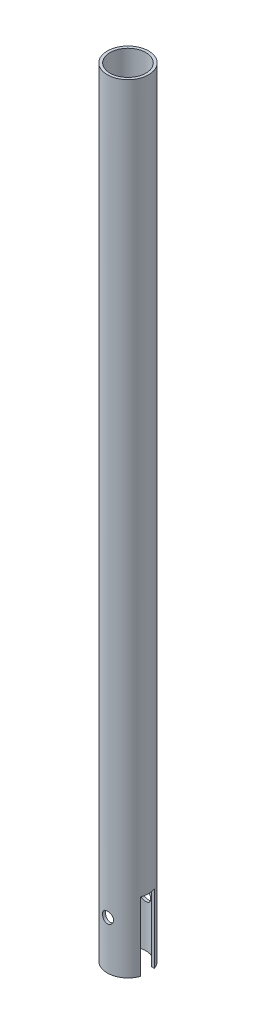
ISO-10303-21;
HEADER;
FILE_DESCRIPTION(('STEP AP214'),'2;1');
FILE_NAME('part.step','',(''),(''),'','','');
FILE_SCHEMA(('AUTOMOTIVE_DESIGN { 1 0 10303 214 1 1 1 1 }'));
ENDSEC;
DATA;
#1=APPLICATION_CONTEXT('core data for automotive mechanical design processes');
#2=APPLICATION_PROTOCOL_DEFINITION('international standard','automotive_design',2000,#1);
#3=PRODUCT_CONTEXT('',#1,'mechanical');
#4=PRODUCT('Part','Part','',(#3));
#5=PRODUCT_RELATED_PRODUCT_CATEGORY('part','',(#4));
#6=PRODUCT_DEFINITION_FORMATION('','',#4);
#7=PRODUCT_DEFINITION_CONTEXT('part definition',#1,'design');
#8=PRODUCT_DEFINITION('design','',#6,#7);
#9=PRODUCT_DEFINITION_SHAPE('','',#8);
#10=(LENGTH_UNIT() NAMED_UNIT(*) SI_UNIT(.MILLI.,.METRE.));
#11=(NAMED_UNIT(*) PLANE_ANGLE_UNIT() SI_UNIT($,.RADIAN.));
#12=(NAMED_UNIT(*) SI_UNIT($,.STERADIAN.) SOLID_ANGLE_UNIT());
#13=UNCERTAINTY_MEASURE_WITH_UNIT(LENGTH_MEASURE(1.E-05),#10,'distance_accuracy_value','');
#14=(GEOMETRIC_REPRESENTATION_CONTEXT(3) GLOBAL_UNCERTAINTY_ASSIGNED_CONTEXT((#13)) GLOBAL_UNIT_ASSIGNED_CONTEXT((#10,
#11,#12)) REPRESENTATION_CONTEXT('',''));
#15=CARTESIAN_POINT('',(0.,0.,0.));
#16=DIRECTION('',(0.,0.,1.));
#17=DIRECTION('',(1.,0.,0.));
#18=AXIS2_PLACEMENT_3D('',#15,#16,#17);
#19=CARTESIAN_POINT('',(0.,-282.5,0.));
#20=DIRECTION('',(0.,1.,0.));
#21=DIRECTION('',(0.,0.,1.));
#22=AXIS2_PLACEMENT_3D('',#19,#20,#21);
#23=PLANE('',#22);
#24=CARTESIAN_POINT('',(0.,-282.5,0.));
#25=DIRECTION('',(0.,1.,0.));
#26=DIRECTION('',(0.,0.,1.));
#27=AXIS2_PLACEMENT_3D('',#24,#25,#26);
#28=CIRCLE('',#27,15.);
#29=CARTESIAN_POINT('',(-14.142135623731,-282.5,4.99999999999993));
#30=VERTEX_POINT('',#29);
#31=CARTESIAN_POINT('',(14.142135623731,-282.5,4.99999999999993));
#32=VERTEX_POINT('',#31);
#33=EDGE_CURVE('E130',#30,#32,#28,.T.);
#34=ORIENTED_EDGE('',*,*,#33,.F.);
#35=DIRECTION('',(1.,0.,0.));
#36=VECTOR('',#35,1.);
#37=CARTESIAN_POINT('',(-282.5,-282.5,4.99999999999993));
#38=LINE('',#37,#36);
#39=CARTESIAN_POINT('',(-12.,-282.5,4.99999999999993));
#40=VERTEX_POINT('',#39);
#41=EDGE_CURVE('E110',#30,#40,#38,.T.);
#42=ORIENTED_EDGE('',*,*,#41,.T.);
#43=CARTESIAN_POINT('',(0.,-282.5,0.));
#44=DIRECTION('',(0.,1.,0.));
#45=DIRECTION('',(0.,0.,1.));
#46=AXIS2_PLACEMENT_3D('',#43,#44,#45);
#47=CIRCLE('',#46,13.);
#48=CARTESIAN_POINT('',(12.,-282.5,4.99999999999993));
#49=VERTEX_POINT('',#48);
#50=EDGE_CURVE('E134',#40,#49,#47,.T.);
#51=ORIENTED_EDGE('',*,*,#50,.T.);
#52=EDGE_CURVE('E124',#49,#32,#38,.T.);
#53=ORIENTED_EDGE('',*,*,#52,.T.);
#54=EDGE_LOOP('',(#34,#42,#51,#53));
#55=FACE_BOUND('',#54,.T.);
#56=ADVANCED_FACE('F38',(#55),#23,.F.);
#57=CARTESIAN_POINT('',(0.,282.5,0.));
#58=DIRECTION('',(0.,1.,0.));
#59=DIRECTION('',(0.,0.,1.));
#60=AXIS2_PLACEMENT_3D('',#57,#58,#59);
#61=PLANE('',#60);
#62=CARTESIAN_POINT('',(0.,282.5,0.));
#63=DIRECTION('',(0.,1.,0.));
#64=DIRECTION('',(0.,0.,1.));
#65=AXIS2_PLACEMENT_3D('',#62,#63,#64);
#66=CIRCLE('',#65,15.);
#67=CARTESIAN_POINT('',(0.,282.5,15.));
#68=VERTEX_POINT('',#67);
#69=EDGE_CURVE('E145',#68,#68,#66,.T.);
#70=ORIENTED_EDGE('',*,*,#69,.T.);
#71=EDGE_LOOP('',(#70));
#72=FACE_BOUND('',#71,.T.);
#73=CARTESIAN_POINT('',(0.,282.5,0.));
#74=DIRECTION('',(0.,1.,0.));
#75=DIRECTION('',(0.,0.,1.));
#76=AXIS2_PLACEMENT_3D('',#73,#74,#75);
#77=CIRCLE('',#76,13.);
#78=CARTESIAN_POINT('',(0.,282.5,13.));
#79=VERTEX_POINT('',#78);
#80=EDGE_CURVE('E140',#79,#79,#77,.T.);
#81=ORIENTED_EDGE('',*,*,#80,.F.);
#82=EDGE_LOOP('',(#81));
#83=FACE_BOUND('',#82,.T.);
#84=ADVANCED_FACE('F276',(#72,#83),#61,.T.);
#85=CARTESIAN_POINT('',(14.1421356237309,-282.5,-5.00000000000007));
#86=VERTEX_POINT('',#85);
#87=CARTESIAN_POINT('',(-14.1421356237309,-282.5,-5.00000000000007));
#88=VERTEX_POINT('',#87);
#89=EDGE_CURVE('E139',#86,#88,#28,.T.);
#90=ORIENTED_EDGE('',*,*,#89,.F.);
#91=DIRECTION('',(1.,0.,0.));
#92=VECTOR('',#91,1.);
#93=CARTESIAN_POINT('',(-282.5,-282.5,-5.00000000000007));
#94=LINE('',#93,#92);
#95=CARTESIAN_POINT('',(12.,-282.5,-5.00000000000007));
#96=VERTEX_POINT('',#95);
#97=EDGE_CURVE('E123',#96,#86,#94,.T.);
#98=ORIENTED_EDGE('',*,*,#97,.F.);
#99=CARTESIAN_POINT('',(-12.,-282.5,-5.00000000000007));
#100=VERTEX_POINT('',#99);
#101=EDGE_CURVE('E147',#96,#100,#47,.T.);
#102=ORIENTED_EDGE('',*,*,#101,.T.);
#103=EDGE_CURVE('E70',#88,#100,#94,.T.);
#104=ORIENTED_EDGE('',*,*,#103,.F.);
#105=EDGE_LOOP('',(#90,#98,#102,#104));
#106=FACE_BOUND('',#105,.T.);
#107=ADVANCED_FACE('F227',(#106),#23,.F.);
#108=CARTESIAN_POINT('',(0.,282.5,0.));
#109=DIRECTION('',(0.,-1.,0.));
#110=DIRECTION('',(0.,0.,-1.));
#111=AXIS2_PLACEMENT_3D('',#108,#109,#110);
#112=CYLINDRICAL_SURFACE('',#111,15.);
#113=CARTESIAN_POINT('',(0.,-243.5,-15.));
#114=CARTESIAN_POINT('',(-0.220509111665707,-243.50000523387,-14.9999966762032));
#115=CARTESIAN_POINT('',(-0.441074320443678,-243.518295228379,-14.995089723243));
#116=CARTESIAN_POINT('',(-0.875850902708924,-243.590842461477,-14.9759914724332));
#117=CARTESIAN_POINT('',(-1.09005916663817,-243.645117008852,-14.9617957066517));
#118=CARTESIAN_POINT('',(-1.50578317809062,-243.787743333728,-14.9256866650558));
#119=CARTESIAN_POINT('',(-1.70731490203056,-243.876051175332,-14.9037833426075));
#120=CARTESIAN_POINT('',(-2.0927073727853,-244.084074485333,-14.8545739830336));
#121=CARTESIAN_POINT('',(-2.27656694089924,-244.203792046719,-14.8272675859036));
#122=CARTESIAN_POINT('',(-2.62565900748002,-244.474167032827,-14.7694922980399));
#123=CARTESIAN_POINT('',(-2.79042337972557,-244.625417336017,-14.7389693535736));
#124=CARTESIAN_POINT('',(-3.09257427321276,-244.953296966127,-14.6785481935918));
#125=CARTESIAN_POINT('',(-3.22995726991329,-245.129929555235,-14.6486500589449));
#126=CARTESIAN_POINT('',(-3.4757281848683,-245.507296469651,-14.5923107492874));
#127=CARTESIAN_POINT('',(-3.58357755472975,-245.708392656523,-14.5659377712648));
#128=CARTESIAN_POINT('',(-3.76375096153988,-246.126680222185,-14.5204295463637));
#129=CARTESIAN_POINT('',(-3.83608154902738,-246.343868624663,-14.5012929650653));
#130=CARTESIAN_POINT('',(-3.94153840453008,-246.78299107565,-14.472982316048));
#131=CARTESIAN_POINT('',(-3.97551340489383,-247.004707079861,-14.4635929562298));
#132=CARTESIAN_POINT('',(-4.00594069411639,-247.450875366613,-14.4551966183274));
#133=CARTESIAN_POINT('',(-4.00239999411507,-247.675327130048,-14.4561877002889));
#134=CARTESIAN_POINT('',(-3.95857020005399,-248.113970830748,-14.4682475760406));
#135=CARTESIAN_POINT('',(-3.9193081212953,-248.328274364077,-14.4790347102306));
#136=CARTESIAN_POINT('',(-3.80679497444366,-248.747136668912,-14.5090202616138));
#137=CARTESIAN_POINT('',(-3.7335411898599,-248.951694660151,-14.5282193510522));
#138=CARTESIAN_POINT('',(-3.55428713930513,-249.347936287617,-14.5731132349677));
#139=CARTESIAN_POINT('',(-3.44792682275569,-249.539448678572,-14.5988788563741));
#140=CARTESIAN_POINT('',(-3.20573007647555,-249.902268317703,-14.6539645928489));
#141=CARTESIAN_POINT('',(-3.06988784448502,-250.073571578313,-14.6832854071037));
#142=CARTESIAN_POINT('',(-2.76733214526836,-250.39697799491,-14.7433502125973));
#143=CARTESIAN_POINT('',(-2.59975625456596,-250.54827263663,-14.7741094297766));
#144=CARTESIAN_POINT('',(-2.24123533641272,-250.820777560701,-14.8327276255263));
#145=CARTESIAN_POINT('',(-2.05028938841015,-250.941986657405,-14.8605864897711));
#146=CARTESIAN_POINT('',(-1.64919651099488,-251.151235805649,-14.9104364079659));
#147=CARTESIAN_POINT('',(-1.43896980510357,-251.239129540897,-14.9324014566712));
#148=CARTESIAN_POINT('',(-1.00600458878079,-251.378094377627,-14.96780088802));
#149=CARTESIAN_POINT('',(-0.783268823856654,-251.429173525448,-14.981237134675));
#150=CARTESIAN_POINT('',(-0.338508166291042,-251.491789753836,-14.9977831711677));
#151=CARTESIAN_POINT('',(-0.116648475282772,-251.504426079702,-15.0011799494192));
#152=CARTESIAN_POINT('',(0.326020091802384,-251.492833671506,-14.9980894338339));
#153=CARTESIAN_POINT('',(0.546829074124211,-251.468608747788,-14.9916031616071));
#154=CARTESIAN_POINT('',(0.977204899803543,-251.38488310508,-14.9696607099204));
#155=CARTESIAN_POINT('',(1.18689970405555,-251.325995507604,-14.9543605309265));
#156=CARTESIAN_POINT('',(1.59341394235211,-251.175328110984,-14.9165258978828));
#157=CARTESIAN_POINT('',(1.79023197843204,-251.083544747499,-14.8939906599234));
#158=CARTESIAN_POINT('',(2.16967694933589,-250.867652225639,-14.8435132111904));
#159=CARTESIAN_POINT('',(2.35195037692237,-250.742945066404,-14.8154737320985));
#160=CARTESIAN_POINT('',(2.69336927079431,-250.465496739684,-14.7572290473119));
#161=CARTESIAN_POINT('',(2.85251015759838,-250.312750034798,-14.7270234145527));
#162=CARTESIAN_POINT('',(3.14777848957546,-249.978428845011,-14.6667949173317));
#163=CARTESIAN_POINT('',(3.28313038499625,-249.796162877209,-14.6368012285772));
#164=CARTESIAN_POINT('',(3.5213438237024,-249.410870607801,-14.5813289436636));
#165=CARTESIAN_POINT('',(3.62420672244341,-249.207845172756,-14.5558501591602));
#166=CARTESIAN_POINT('',(3.79374823172204,-248.787809385847,-14.5125853674305));
#167=CARTESIAN_POINT('',(3.8606362450784,-248.570888376362,-14.4947549662348));
#168=CARTESIAN_POINT('',(3.95682410237656,-248.128321360653,-14.4687965026614));
#169=CARTESIAN_POINT('',(3.98613355205236,-247.902677599313,-14.4606659608681));
#170=CARTESIAN_POINT('',(4.00577979307212,-247.457010424211,-14.4552348910192));
#171=CARTESIAN_POINT('',(3.99736311235129,-247.237045359427,-14.4575879532022));
#172=CARTESIAN_POINT('',(3.94468751999858,-246.801792971929,-14.4720479199639));
#173=CARTESIAN_POINT('',(3.9004295306998,-246.58650552899,-14.4841545735456));
#174=CARTESIAN_POINT('',(3.77805031399794,-246.16828849576,-14.516551421902));
#175=CARTESIAN_POINT('',(3.70019322151267,-245.965276314541,-14.5367777005106));
#176=CARTESIAN_POINT('',(3.51303109124667,-245.575042338926,-14.5831363626058));
#177=CARTESIAN_POINT('',(3.40372112049205,-245.387823027398,-14.6092696723953));
#178=CARTESIAN_POINT('',(3.15297818537665,-245.028539281008,-14.6654584288421));
#179=CARTESIAN_POINT('',(3.01069459535829,-244.857082930048,-14.6956066620426));
#180=CARTESIAN_POINT('',(2.69966107022194,-244.540075096665,-14.7559100756513));
#181=CARTESIAN_POINT('',(2.53090470871748,-244.394529922662,-14.7860652559664));
#182=CARTESIAN_POINT('',(2.16735996217739,-244.130415524706,-14.8437562480818));
#183=CARTESIAN_POINT('',(1.97209192350356,-244.012489978701,-14.8712222262917));
#184=CARTESIAN_POINT('',(1.56377728083377,-243.811325168141,-14.9196762020573));
#185=CARTESIAN_POINT('',(1.35074218939259,-243.728063648673,-14.9406683536717));
#186=CARTESIAN_POINT('',(0.948749409761977,-243.609449429169,-14.9710950502695));
#187=CARTESIAN_POINT('',(0.761524033130066,-243.568501232815,-14.9818554118521));
#188=CARTESIAN_POINT('',(0.382879590634148,-243.513775587666,-14.9963089807291));
#189=CARTESIAN_POINT('',(0.191460940809718,-243.4999954556,-15.0000028859454));
#190=CARTESIAN_POINT('',(0.,-243.5,-15.));
#191=B_SPLINE_CURVE_WITH_KNOTS('',3,(#113,#114,#115,#116,#117,#118,#119,#120,#121,#122,#123,
#124,#125,#126,#127,#128,#129,#130,#131,#132,#133,#134,#135,#136,#137,#138,#139,#140,#141,#142,
#143,#144,#145,#146,#147,#148,#149,#150,#151,#152,#153,#154,#155,#156,#157,#158,#159,#160,#161,
#162,#163,#164,#165,#166,#167,#168,#169,#170,#171,#172,#173,#174,#175,#176,#177,#178,#179,#180,
#181,#182,#183,#184,#185,#186,#187,#188,#189,#190),.UNSPECIFIED.,.T.,.F.,(4,2,2,2,2,2,2,2,2,2,2,
2,2,2,2,2,2,2,2,2,2,2,2,2,2,2,2,2,2,2,2,2,2,2,2,2,2,2,4),(0.,0.660825197899139,1.3219684875229,
1.98226110594384,2.6425977341735,3.31669795909933,3.99088489850297,4.6766516504646,
5.362291882594,6.03244316500935,6.70246920808638,7.35382004091992,8.00522293625877,
8.66397346692996,9.3228537623526,10.0032251962465,10.683623438752,11.3669761920608,
12.0501795438028,12.7136543504909,13.377060578507,14.0290707128423,14.6811515155123,
15.346005720091,16.0109913651777,16.6947299276557,17.3784399604821,18.0581259539877,
18.7376381732797,19.394866848109,20.0520786104838,20.7042153090379,21.3564543425319,
22.0278867914996,22.6994824867208,23.3854450456898,24.0709665229755,24.6447963799386,
25.2185695593995),.UNSPECIFIED.);
#192=CARTESIAN_POINT('',(0.,-243.5,-15.));
#193=VERTEX_POINT('',#192);
#194=EDGE_CURVE('E191',#193,#193,#191,.T.);
#195=ORIENTED_EDGE('',*,*,#194,.T.);
#196=EDGE_LOOP('',(#195));
#197=FACE_BOUND('',#196,.T.);
#198=CARTESIAN_POINT('',(4.,-247.5,14.456832294801));
#199=CARTESIAN_POINT('',(3.99999468631742,-247.720351875481,14.456836113945));
#200=CARTESIAN_POINT('',(3.98172986449485,-247.940760000952,14.4619252909935));
#201=CARTESIAN_POINT('',(3.90929166520474,-248.375210843113,14.4816712231019));
#202=CARTESIAN_POINT('',(3.85510027241905,-248.589250309956,14.4963327781587));
#203=CARTESIAN_POINT('',(3.71271691120147,-249.004616139894,14.5334475035368));
#204=CARTESIAN_POINT('',(3.62457275084356,-249.205959917657,14.5558897136841));
#205=CARTESIAN_POINT('',(3.41693569127408,-249.59103348012,14.606023098408));
#206=CARTESIAN_POINT('',(3.29744035682899,-249.774761895014,14.6337146806885));
#207=CARTESIAN_POINT('',(3.02729695749118,-250.123985093975,14.6920027910693));
#208=CARTESIAN_POINT('',(2.87600595008415,-250.288974034929,14.7226508223289));
#209=CARTESIAN_POINT('',(2.5479485456804,-250.591563153902,14.7829540287301));
#210=CARTESIAN_POINT('',(2.37117951069327,-250.729160492284,14.8126091006688));
#211=CARTESIAN_POINT('',(1.99367634174653,-250.975169876806,14.8681597693684));
#212=CARTESIAN_POINT('',(1.79260363975894,-251.083079037266,14.8939875252459));
#213=CARTESIAN_POINT('',(1.37436608945817,-251.263369270734,14.9383825242367));
#214=CARTESIAN_POINT('',(1.1572039617502,-251.335756334563,14.9569509915253));
#215=CARTESIAN_POINT('',(0.718231923620181,-251.441310440472,14.9843710715292));
#216=CARTESIAN_POINT('',(0.496642448401833,-251.475337953252,14.9934355350053));
#217=CARTESIAN_POINT('',(0.0507271070171427,-251.505914240214,15.001570492355));
#218=CARTESIAN_POINT('',(-0.173598294877076,-251.50246928726,15.0006426589323));
#219=CARTESIAN_POINT('',(-0.612628474222695,-251.458804374921,14.9890535171952));
#220=CARTESIAN_POINT('',(-0.827433201442201,-251.419514084727,14.9786382805395));
#221=CARTESIAN_POINT('',(-1.24728263114213,-251.306775724436,14.9495349718099));
#222=CARTESIAN_POINT('',(-1.45232677636124,-251.233325706628,14.9308464280136));
#223=CARTESIAN_POINT('',(-1.84920789029504,-251.053640304815,14.886931381996));
#224=CARTESIAN_POINT('',(-2.0408933726588,-250.947086385799,14.8616417575466));
#225=CARTESIAN_POINT('',(-2.4039799975293,-250.704462360981,14.8072493701969));
#226=CARTESIAN_POINT('',(-2.57537717617274,-250.568386501942,14.7781458644853));
#227=CARTESIAN_POINT('',(-2.89857073893016,-250.265646284134,14.7182254587483));
#228=CARTESIAN_POINT('',(-3.04960384035148,-250.098171109909,14.6873833872759));
#229=CARTESIAN_POINT('',(-3.32162664209938,-249.739950647514,14.6282681005693));
#230=CARTESIAN_POINT('',(-3.44261451061105,-249.549203941569,14.5999950420307));
#231=CARTESIAN_POINT('',(-3.651693583714,-249.148199796381,14.549118045243));
#232=CARTESIAN_POINT('',(-3.7395773319603,-248.937829298272,14.5265501404503));
#233=CARTESIAN_POINT('',(-3.87848003366225,-248.504547001192,14.4900865003605));
#234=CARTESIAN_POINT('',(-3.92950812921311,-248.28163832713,14.4761886145698));
#235=CARTESIAN_POINT('',(-3.99193514186922,-247.836745577921,14.459096712616));
#236=CARTESIAN_POINT('',(-4.00447265242678,-247.614932902752,14.4555952643646));
#237=CARTESIAN_POINT('',(-3.99269962245616,-247.172380454389,14.4588515677209));
#238=CARTESIAN_POINT('',(-3.96839300344559,-246.951640569522,14.4656082275034));
#239=CARTESIAN_POINT('',(-3.88462543740026,-246.521886811815,14.4883224864021));
#240=CARTESIAN_POINT('',(-3.82584895825867,-246.312729124125,14.5041007939926));
#241=CARTESIAN_POINT('',(-3.67557973450926,-245.907240737281,14.542905379049));
#242=CARTESIAN_POINT('',(-3.58408271753295,-245.710911717145,14.5659326029695));
#243=CARTESIAN_POINT('',(-3.36865811017419,-245.331890085129,14.6172714494615));
#244=CARTESIAN_POINT('',(-3.2440619047585,-245.14959204822,14.6456880974578));
#245=CARTESIAN_POINT('',(-2.96680455975028,-244.808073396594,14.7043568386728));
#246=CARTESIAN_POINT('',(-2.81413814445932,-244.648857130092,14.7346092762046));
#247=CARTESIAN_POINT('',(-2.47980756500968,-244.3532950535,14.7945992976893));
#248=CARTESIAN_POINT('',(-2.29743283201769,-244.217743246043,14.824296730477));
#249=CARTESIAN_POINT('',(-1.91185687188147,-243.979178025179,14.8789334003425));
#250=CARTESIAN_POINT('',(-1.70865675403776,-243.876162879842,14.9038728906581));
#251=CARTESIAN_POINT('',(-1.28862826965174,-243.706540735277,14.9460230179852));
#252=CARTESIAN_POINT('',(-1.07191570576466,-243.639661961113,14.9632911696077));
#253=CARTESIAN_POINT('',(-0.629798769462634,-243.543422543871,14.9884060757449));
#254=CARTESIAN_POINT('',(-0.404396334640486,-243.514053586451,14.9962549180996));
#255=CARTESIAN_POINT('',(0.0412840026922955,-243.494188352517,15.0015482687538));
#256=CARTESIAN_POINT('',(0.261507023055727,-243.502527361738,14.9993045257616));
#257=CARTESIAN_POINT('',(0.697296609261436,-243.55513698715,14.9853698195772));
#258=CARTESIAN_POINT('',(0.91286334962563,-243.599406254234,14.9736792110957));
#259=CARTESIAN_POINT('',(1.33182024692843,-243.721961209837,14.9422262078185));
#260=CARTESIAN_POINT('',(1.53528402370309,-243.800010586945,14.9225199437846));
#261=CARTESIAN_POINT('',(1.92634419694272,-243.987699203492,14.8770963303299));
#262=CARTESIAN_POINT('',(2.11393836332431,-244.097342873226,14.8513781379851));
#263=CARTESIAN_POINT('',(2.47335653734735,-244.348516544274,14.7958266244824));
#264=CARTESIAN_POINT('',(2.64462672346663,-244.490818761397,14.7659018674327));
#265=CARTESIAN_POINT('',(2.96125074312267,-244.80180549873,14.7056800015451));
#266=CARTESIAN_POINT('',(3.10659774486097,-244.970496951639,14.6753827967944));
#267=CARTESIAN_POINT('',(3.37041400465123,-245.333936791635,14.6170791927771));
#268=CARTESIAN_POINT('',(3.48822188522467,-245.529176627314,14.5891378244929));
#269=CARTESIAN_POINT('',(3.68917378060109,-245.93741262172,14.5396278780694));
#270=CARTESIAN_POINT('',(3.77234046734664,-246.150397057079,14.5180551344989));
#271=CARTESIAN_POINT('',(3.89076248504962,-246.552162672102,14.4867200130775));
#272=CARTESIAN_POINT('',(3.93163036798979,-246.739202529113,14.4756028054439));
#273=CARTESIAN_POINT('',(3.98624988587759,-247.117481115988,14.4606577042314));
#274=CARTESIAN_POINT('',(4.0000046126432,-247.308719364578,14.4568289795203));
#275=CARTESIAN_POINT('',(4.,-247.5,14.456832294801));
#276=B_SPLINE_CURVE_WITH_KNOTS('',3,(#198,#199,#200,#201,#202,#203,#204,#205,#206,#207,#208,
#209,#210,#211,#212,#213,#214,#215,#216,#217,#218,#219,#220,#221,#222,#223,#224,#225,#226,#227,
#228,#229,#230,#231,#232,#233,#234,#235,#236,#237,#238,#239,#240,#241,#242,#243,#244,#245,#246,
#247,#248,#249,#250,#251,#252,#253,#254,#255,#256,#257,#258,#259,#260,#261,#262,#263,#264,#265,
#266,#267,#268,#269,#270,#271,#272,#273,#274,#275),.UNSPECIFIED.,.T.,.F.,(4,2,2,2,2,2,2,2,2,2,2,
2,2,2,2,2,2,2,2,2,2,2,2,2,2,2,2,2,2,2,2,2,2,2,2,2,2,2,4),(0.,0.66035225623206,1.32103589570041,
1.9807926231923,2.64060061312211,3.31531832260425,3.99010594248924,4.67570414741608,
5.36118668608491,6.03096608632961,6.70063336771207,7.35341141601607,8.00622668881391,
8.6655289781114,9.32495986788981,10.0046352460066,10.6843520527916,11.3682603019535,
12.0519988484194,12.7153066848897,13.3785439269193,14.0290370087007,14.6796150573457,
15.3444926994046,16.0094954308787,16.6937181392419,17.3779044202113,18.0568707918772,
18.7356866392293,19.3936810983785,20.0516508523085,20.7050902974225,21.3586214153685,
22.0295770798808,22.7007093076701,23.3866007797608,24.0720426420754,24.6453393534799,
25.2185706858622),.UNSPECIFIED.);
#277=CARTESIAN_POINT('',(4.,-247.5,14.456832294801));
#278=VERTEX_POINT('',#277);
#279=EDGE_CURVE('E185',#278,#278,#276,.T.);
#280=ORIENTED_EDGE('',*,*,#279,.T.);
#281=EDGE_LOOP('',(#280));
#282=FACE_BOUND('',#281,.T.);
#283=ORIENTED_EDGE('',*,*,#69,.F.);
#284=EDGE_LOOP('',(#283));
#285=FACE_BOUND('',#284,.T.);
#286=ORIENTED_EDGE('',*,*,#33,.T.);
#287=DIRECTION('',(0.,-1.,0.));
#288=VECTOR('',#287,1.);
#289=CARTESIAN_POINT('',(14.1421356237309,282.5,5.00000000000006));
#290=LINE('',#289,#288);
#291=CARTESIAN_POINT('',(14.142135623731,-232.5,4.99999999999994));
#292=VERTEX_POINT('',#291);
#293=EDGE_CURVE('E135',#32,#292,#290,.F.);
#294=ORIENTED_EDGE('',*,*,#293,.T.);
#295=CARTESIAN_POINT('',(0.,-232.5,0.));
#296=DIRECTION('',(0.,1.,0.));
#297=DIRECTION('',(0.,0.,1.));
#298=AXIS2_PLACEMENT_3D('',#295,#296,#297);
#299=CIRCLE('',#298,15.);
#300=CARTESIAN_POINT('',(14.1421356237309,-232.5,-5.00000000000007));
#301=VERTEX_POINT('',#300);
#302=EDGE_CURVE('E218',#292,#301,#299,.T.);
#303=ORIENTED_EDGE('',*,*,#302,.T.);
#304=DIRECTION('',(0.,-1.,0.));
#305=VECTOR('',#304,1.);
#306=CARTESIAN_POINT('',(14.1421356237309,282.5,-5.00000000000007));
#307=LINE('',#306,#305);
#308=EDGE_CURVE('E212',#301,#86,#307,.T.);
#309=ORIENTED_EDGE('',*,*,#308,.T.);
#310=ORIENTED_EDGE('',*,*,#89,.T.);
#311=DIRECTION('',(0.,-1.,0.));
#312=VECTOR('',#311,1.);
#313=CARTESIAN_POINT('',(-14.1421356237309,282.5,-5.00000000000007));
#314=LINE('',#313,#312);
#315=CARTESIAN_POINT('',(-14.1421356237309,-232.5,-5.00000000000007));
#316=VERTEX_POINT('',#315);
#317=EDGE_CURVE('E209',#88,#316,#314,.F.);
#318=ORIENTED_EDGE('',*,*,#317,.T.);
#319=CARTESIAN_POINT('',(-14.142135623731,-232.5,4.99999999999994));
#320=VERTEX_POINT('',#319);
#321=EDGE_CURVE('E132',#316,#320,#299,.T.);
#322=ORIENTED_EDGE('',*,*,#321,.T.);
#323=DIRECTION('',(0.,-1.,0.));
#324=VECTOR('',#323,1.);
#325=CARTESIAN_POINT('',(-14.1421356237309,282.5,5.00000000000006));
#326=LINE('',#325,#324);
#327=EDGE_CURVE('E114',#320,#30,#326,.T.);
#328=ORIENTED_EDGE('',*,*,#327,.T.);
#329=EDGE_LOOP('',(#286,#294,#303,#309,#310,#318,#322,#328));
#330=FACE_BOUND('',#329,.T.);
#331=ADVANCED_FACE('F40',(#197,#282,#285,#330),#112,.T.);
#332=CARTESIAN_POINT('',(0.,282.5,0.));
#333=DIRECTION('',(0.,-1.,0.));
#334=DIRECTION('',(0.,0.,-1.));
#335=AXIS2_PLACEMENT_3D('',#332,#333,#334);
#336=CYLINDRICAL_SURFACE('',#335,13.);
#337=CARTESIAN_POINT('',(0.,-243.5,-13.));
#338=CARTESIAN_POINT('',(-0.219172943108158,-243.500001921842,-12.9999985837487));
#339=CARTESIAN_POINT('',(-0.438365522698947,-243.518073295206,-12.9944047158586));
#340=CARTESIAN_POINT('',(-0.870351057968741,-243.58969882387,-12.9726371053014));
#341=CARTESIAN_POINT('',(-1.08314237260056,-243.643261998265,-12.9564606734307));
#342=CARTESIAN_POINT('',(-1.49603309396941,-243.783901413786,-12.9152971697535));
#343=CARTESIAN_POINT('',(-1.69615125418069,-243.870926721554,-12.8903234932247));
#344=CARTESIAN_POINT('',(-2.07895491073436,-244.075806414734,-12.8341507183588));
#345=CARTESIAN_POINT('',(-2.26163781838711,-244.193665368468,-12.8029506976878));
#346=CARTESIAN_POINT('',(-2.60987398495357,-244.46059535088,-12.7365950481322));
#347=CARTESIAN_POINT('',(-2.77482977131674,-244.610424838486,-12.7013552117493));
#348=CARTESIAN_POINT('',(-3.07771416539745,-244.935427247016,-12.6313850563073));
#349=CARTESIAN_POINT('',(-3.21563793325194,-245.110604696544,-12.5966548295175));
#350=CARTESIAN_POINT('',(-3.46374552369844,-245.486457208855,-12.5307375569115));
#351=CARTESIAN_POINT('',(-3.57318962723974,-245.687640578596,-12.4996547208754));
#352=CARTESIAN_POINT('',(-3.75644488363177,-246.106667927474,-12.4458149677457));
#353=CARTESIAN_POINT('',(-3.83026509829397,-246.324507653307,-12.4230559336455));
#354=CARTESIAN_POINT('',(-3.93800321026308,-246.763934612106,-12.3893201800033));
#355=CARTESIAN_POINT('',(-3.9730267911173,-246.985225067219,-12.3780178006712));
#356=CARTESIAN_POINT('',(-4.00563111791087,-247.43080748114,-12.3675074101));
#357=CARTESIAN_POINT('',(-4.00322147146571,-247.655098655016,-12.3682962955151));
#358=CARTESIAN_POINT('',(-3.96189396455672,-248.091230141224,-12.3815913869604));
#359=CARTESIAN_POINT('',(-3.92437369402148,-248.303218850725,-12.3936490135325));
#360=CARTESIAN_POINT('',(-3.81615290498389,-248.717733393271,-12.4273954440124));
#361=CARTESIAN_POINT('',(-3.74544895828905,-248.92025824623,-12.4490852430036));
#362=CARTESIAN_POINT('',(-3.57186443402679,-249.313460095665,-12.5000014147365));
#363=CARTESIAN_POINT('',(-3.46853941654592,-249.50392697125,-12.5293308435506));
#364=CARTESIAN_POINT('',(-3.23295451696217,-249.86528108875,-12.5921734714446));
#365=CARTESIAN_POINT('',(-3.10068731271404,-250.036163359214,-12.62568772833));
#366=CARTESIAN_POINT('',(-2.80408228262994,-250.361408776662,-12.6949310396933));
#367=CARTESIAN_POINT('',(-2.63858832591731,-250.514712565133,-12.7306926222691));
#368=CARTESIAN_POINT('',(-2.28379541764926,-250.791644408687,-12.7990966106587));
#369=CARTESIAN_POINT('',(-2.09449480981528,-250.915270397281,-12.8317387991713));
#370=CARTESIAN_POINT('',(-1.69546584739521,-251.130025954255,-12.8905511373571));
#371=CARTESIAN_POINT('',(-1.48559743793386,-251.220909728078,-12.9166718999808));
#372=CARTESIAN_POINT('',(-1.05256186981956,-251.365772507917,-12.959142046389));
#373=CARTESIAN_POINT('',(-0.829398642031533,-251.419762364021,-12.9754943028036));
#374=CARTESIAN_POINT('',(-0.385105664864488,-251.48751609315,-12.996125801437));
#375=CARTESIAN_POINT('',(-0.164214373456249,-251.502714705131,-13.0008354422861));
#376=CARTESIAN_POINT('',(0.276982356015461,-251.496490467024,-12.9989200063321));
#377=CARTESIAN_POINT('',(0.49728787237659,-251.475072786126,-12.9922965294463));
#378=CARTESIAN_POINT('',(0.925571602902952,-251.39737903578,-12.9687414969643));
#379=CARTESIAN_POINT('',(1.1337187175601,-251.341950705668,-12.9520607954816));
#380=CARTESIAN_POINT('',(1.53770562273872,-251.198837847146,-12.9103345307273));
#381=CARTESIAN_POINT('',(1.73354390450734,-251.111149373448,-12.8852879443756));
#382=CARTESIAN_POINT('',(2.11255922889336,-250.90365761038,-12.8286676582193));
#383=CARTESIAN_POINT('',(2.29532163039123,-250.78313664647,-12.7969522254664));
#384=CARTESIAN_POINT('',(2.63851213664824,-250.514266339838,-12.7306266724605));
#385=CARTESIAN_POINT('',(2.79893434148182,-250.365909670048,-12.6960157913837));
#386=CARTESIAN_POINT('',(3.09927056018191,-250.038833401102,-12.6261329181932));
#387=CARTESIAN_POINT('',(3.23816262016192,-249.859167848101,-12.5908864468145));
#388=CARTESIAN_POINT('',(3.48390975546085,-249.478313330796,-12.5251192663438));
#389=CARTESIAN_POINT('',(3.59076547791575,-249.277124801369,-12.4945984617991));
#390=CARTESIAN_POINT('',(3.76871415530626,-248.859443486142,-12.4420825365784));
#391=CARTESIAN_POINT('',(3.83995734204779,-248.643019460454,-12.4200516926804));
#392=CARTESIAN_POINT('',(3.94475052243649,-248.200434768548,-12.3871715179266));
#393=CARTESIAN_POINT('',(3.97831429744216,-247.974277693668,-12.376318099014));
#394=CARTESIAN_POINT('',(4.00582647580866,-247.529303855784,-12.3674386474697));
#395=CARTESIAN_POINT('',(4.00144721441457,-247.310599990898,-12.3688710878687));
#396=CARTESIAN_POINT('',(3.95721713123478,-246.877204322305,-12.383091699643));
#397=CARTESIAN_POINT('',(3.9173678708517,-246.662512342419,-12.3958793711567));
#398=CARTESIAN_POINT('',(3.80443315735091,-246.246125142925,-12.4309970121687));
#399=CARTESIAN_POINT('',(3.73181232996621,-246.04429178863,-12.4531933302876));
#400=CARTESIAN_POINT('',(3.55576002495547,-245.655512886749,-12.5045968200808));
#401=CARTESIAN_POINT('',(3.4523224201325,-245.468570309222,-12.5338053857525));
#402=CARTESIAN_POINT('',(3.21296345751965,-245.107174985039,-12.5973303286733));
#403=CARTESIAN_POINT('',(3.07595504034662,-244.933469011735,-12.6317988648256));
#404=CARTESIAN_POINT('',(2.77527343515751,-244.610971866041,-12.7012452733731));
#405=CARTESIAN_POINT('',(2.61159320000448,-244.462187299427,-12.7362232781481));
#406=CARTESIAN_POINT('',(2.25604634155052,-244.189101640806,-12.8040608482866));
#407=CARTESIAN_POINT('',(2.06345773137062,-244.06571284933,-12.8368198127607));
#408=CARTESIAN_POINT('',(1.6592623840196,-243.853231086695,-12.8952876611706));
#409=CARTESIAN_POINT('',(1.44766372806481,-243.764123626758,-12.9209995221938));
#410=CARTESIAN_POINT('',(1.03185930514284,-243.62979857588,-12.9605069669283));
#411=CARTESIAN_POINT('',(0.828806517031051,-243.581261057822,-12.975190696109));
#412=CARTESIAN_POINT('',(0.417174383657033,-243.516363881353,-12.9949369818214));
#413=CARTESIAN_POINT('',(0.208596085316668,-243.499998170902,-13.0000013479058));
#414=CARTESIAN_POINT('',(0.,-243.5,-13.));
#415=B_SPLINE_CURVE_WITH_KNOTS('',3,(#337,#338,#339,#340,#341,#342,#343,#344,#345,#346,#347,
#348,#349,#350,#351,#352,#353,#354,#355,#356,#357,#358,#359,#360,#361,#362,#363,#364,#365,#366,
#367,#368,#369,#370,#371,#372,#373,#374,#375,#376,#377,#378,#379,#380,#381,#382,#383,#384,#385,
#386,#387,#388,#389,#390,#391,#392,#393,#394,#395,#396,#397,#398,#399,#400,#401,#402,#403,#404,
#405,#406,#407,#408,#409,#410,#411,#412,#413,#414),.UNSPECIFIED.,.T.,.F.,(4,2,2,2,2,2,2,2,2,2,2,
2,2,2,2,2,2,2,2,2,2,2,2,2,2,2,2,2,2,2,2,2,2,2,2,2,2,2,4),(0.,0.656752296706404,1.31367154984093,
1.96959482663931,2.62561534027589,3.29939203924103,3.97328926246382,4.66325239950766,
5.35303993483892,6.02261825492435,6.69202472381783,7.33586971906418,7.97978124432903,
8.6328744918095,9.28613315816512,9.96817015993197,10.6502546387186,11.337357751299,
12.0242587074941,12.6853593330308,13.3463666374628,13.9915318440469,14.6367759780257,
15.2974465070423,15.9582911860325,16.6444697560881,17.3306344643609,18.0138796233906,
18.6968748019418,19.3499255144245,20.0029474807923,20.6469886056139,21.2911578685365,
21.9598589697368,22.6287370402031,23.3185550517439,24.0080811951411,24.6332575269447,
25.2583162416424),.UNSPECIFIED.);
#416=CARTESIAN_POINT('',(0.,-243.5,-13.));
#417=VERTEX_POINT('',#416);
#418=EDGE_CURVE('E43',#417,#417,#415,.T.);
#419=ORIENTED_EDGE('',*,*,#418,.F.);
#420=EDGE_LOOP('',(#419));
#421=FACE_BOUND('',#420,.T.);
#422=CARTESIAN_POINT('',(4.,-247.5,12.369316876853));
#423=CARTESIAN_POINT('',(3.99999801911511,-247.718895633332,12.3693186039437));
#424=CARTESIAN_POINT('',(3.98197071667171,-247.937810969677,12.3751910392593));
#425=CARTESIAN_POINT('',(3.91053610201703,-248.36922236337,12.3979463497334));
#426=CARTESIAN_POINT('',(3.85711835938025,-248.581716508926,12.4148324708708));
#427=CARTESIAN_POINT('',(3.71690370106221,-248.993975615948,12.4575254794133));
#428=CARTESIAN_POINT('',(3.63016446342584,-249.193761881516,12.4833169442959));
#429=CARTESIAN_POINT('',(3.42596036632786,-249.575999701798,12.5408933805394));
#430=CARTESIAN_POINT('',(3.30849039649876,-249.758448366468,12.5726793485105));
#431=CARTESIAN_POINT('',(3.04197085623715,-250.106907138944,12.6398503897334));
#432=CARTESIAN_POINT('',(2.89207511617123,-250.272254846984,12.6753151386567));
#433=CARTESIAN_POINT('',(2.56677072449477,-250.575907436167,12.7451687686073));
#434=CARTESIAN_POINT('',(2.3913586280337,-250.714208659964,12.7795575036037));
#435=CARTESIAN_POINT('',(2.01525938208343,-250.962747275999,12.8442933421818));
#436=CARTESIAN_POINT('',(1.81410355849338,-251.072305135706,12.8745356678172));
#437=CARTESIAN_POINT('',(1.39513299722327,-251.255777884019,12.9266426148966));
#438=CARTESIAN_POINT('',(1.17732206216617,-251.329700880637,12.9485091418561));
#439=CARTESIAN_POINT('',(0.738157579337927,-251.437601429225,12.9808368461316));
#440=CARTESIAN_POINT('',(0.517106217993636,-251.472710553444,12.9916204300486));
#441=CARTESIAN_POINT('',(0.0720049610420021,-251.505569212853,13.0017046369346));
#442=CARTESIAN_POINT('',(-0.15204426222767,-251.503326989111,13.0010077929045));
#443=CARTESIAN_POINT('',(-0.588827128442284,-251.462296890544,12.9884354757464));
#444=CARTESIAN_POINT('',(-0.801688466542009,-251.424735190597,12.9769350788328));
#445=CARTESIAN_POINT('',(-1.21792501207421,-251.316140819166,12.9445070377917));
#446=CARTESIAN_POINT('',(-1.42129960650809,-251.245105988054,12.9235787853994));
#447=CARTESIAN_POINT('',(-1.81565196791397,-251.070777513163,12.8741372192068));
#448=CARTESIAN_POINT('',(-2.00645142072049,-250.967106521837,12.8455357891992));
#449=CARTESIAN_POINT('',(-2.36833122304075,-250.730749615188,12.7837692511187));
#450=CARTESIAN_POINT('',(-2.53940668800685,-250.598056536159,12.7506030170365));
#451=CARTESIAN_POINT('',(-2.86429636287498,-250.301101778663,12.6816607270863));
#452=CARTESIAN_POINT('',(-3.01713209266503,-250.135780029851,12.6458333714272));
#453=CARTESIAN_POINT('',(-3.29319578318252,-249.781512121343,12.5767708183454));
#454=CARTESIAN_POINT('',(-3.41642047456242,-249.59256335649,12.5435359074272));
#455=CARTESIAN_POINT('',(-3.63085630567519,-249.19371386355,12.4831676811185));
#456=CARTESIAN_POINT('',(-3.72171608489966,-248.983613170595,12.4561024174922));
#457=CARTESIAN_POINT('',(-3.86646467810647,-248.550062565503,12.4119395774138));
#458=CARTESIAN_POINT('',(-3.92036629605917,-248.326617305718,12.3948385492109));
#459=CARTESIAN_POINT('',(-3.9878036768142,-247.882070943656,12.3733032661437));
#460=CARTESIAN_POINT('',(-4.00283354414281,-247.661219039525,12.3684004472341));
#461=CARTESIAN_POINT('',(-3.99628663681014,-247.220137228088,12.3705178057723));
#462=CARTESIAN_POINT('',(-3.97471530867987,-246.999907233121,12.3775362092534));
#463=CARTESIAN_POINT('',(-3.89691182757581,-246.572674790519,12.4022436604499));
#464=CARTESIAN_POINT('',(-3.84165844205441,-246.365474860406,12.4196310950035));
#465=CARTESIAN_POINT('',(-3.69920288634877,-245.963306235824,12.4628006686262));
#466=CARTESIAN_POINT('',(-3.61199561171696,-245.768339501369,12.4885841488415));
#467=CARTESIAN_POINT('',(-3.40532167264434,-245.390138176738,12.5465364709729));
#468=CARTESIAN_POINT('',(-3.28502089537804,-245.207384295721,12.5788637480404));
#469=CARTESIAN_POINT('',(-3.01655511441066,-244.864112908898,12.6459284171835));
#470=CARTESIAN_POINT('',(-2.86838309291512,-244.703601021194,12.6806664148693));
#471=CARTESIAN_POINT('',(-2.54132911795291,-244.402750842726,12.7503196549039));
#472=CARTESIAN_POINT('',(-2.36145596254204,-244.263476104598,12.7851864228121));
#473=CARTESIAN_POINT('',(-1.98005258597699,-244.017051927713,12.8497760997718));
#474=CARTESIAN_POINT('',(-1.77852339364156,-243.909900963761,12.8794992530072));
#475=CARTESIAN_POINT('',(-1.36080869978189,-243.731797794001,12.9302779102282));
#476=CARTESIAN_POINT('',(-1.14474466512892,-243.660579716795,12.9513968466186));
#477=CARTESIAN_POINT('',(-0.702944417606215,-243.555716468489,12.9828670740302));
#478=CARTESIAN_POINT('',(-0.477211151465622,-243.522059933797,12.9932216215646));
#479=CARTESIAN_POINT('',(-0.0322851569118239,-243.494175498766,13.0017874205747));
#480=CARTESIAN_POINT('',(0.18680318615842,-243.498409017632,13.0004725447557));
#481=CARTESIAN_POINT('',(0.621007843100269,-243.54248039501,12.9869752203231));
#482=CARTESIAN_POINT('',(0.836124401762878,-243.582316051746,12.9747934437614));
#483=CARTESIAN_POINT('',(1.25379230665728,-243.695491624487,12.9410753081768));
#484=CARTESIAN_POINT('',(1.45646200220844,-243.768430493353,12.919651071453));
#485=CARTESIAN_POINT('',(1.84678805760374,-243.945381267967,12.8696594866927));
#486=CARTESIAN_POINT('',(2.03444187508313,-244.049398421581,12.8410909324027));
#487=CARTESIAN_POINT('',(2.39618281580515,-244.289549472636,12.7786202811857));
#488=CARTESIAN_POINT('',(2.56961302229381,-244.426634667597,12.7445726445579));
#489=CARTESIAN_POINT('',(2.89152018312206,-244.727338979043,12.6754199625408));
#490=CARTESIAN_POINT('',(3.03998975450389,-244.890965918131,12.6403146079033));
#491=CARTESIAN_POINT('',(3.31252080641523,-245.246353952266,12.571699027057));
#492=CARTESIAN_POINT('',(3.43565508724777,-245.438844710169,12.5382751258501));
#493=CARTESIAN_POINT('',(3.64768426995861,-245.842781506827,12.4782454852696));
#494=CARTESIAN_POINT('',(3.73659404904235,-246.054219260039,12.451636785052));
#495=CARTESIAN_POINT('',(3.87056526765236,-246.469576396426,12.4106071392528));
#496=CARTESIAN_POINT('',(3.91896420733355,-246.672332622423,12.3952752982629));
#497=CARTESIAN_POINT('',(3.98367886388828,-247.083387466026,12.3746304857481));
#498=CARTESIAN_POINT('',(4.0000018851377,-247.291684810847,12.3693152332422));
#499=CARTESIAN_POINT('',(4.,-247.5,12.369316876853));
#500=B_SPLINE_CURVE_WITH_KNOTS('',3,(#422,#423,#424,#425,#426,#427,#428,#429,#430,#431,#432,
#433,#434,#435,#436,#437,#438,#439,#440,#441,#442,#443,#444,#445,#446,#447,#448,#449,#450,#451,
#452,#453,#454,#455,#456,#457,#458,#459,#460,#461,#462,#463,#464,#465,#466,#467,#468,#469,#470,
#471,#472,#473,#474,#475,#476,#477,#478,#479,#480,#481,#482,#483,#484,#485,#486,#487,#488,#489,
#490,#491,#492,#493,#494,#495,#496,#497,#498,#499),.UNSPECIFIED.,.T.,.F.,(4,2,2,2,2,2,2,2,2,2,2,
2,2,2,2,2,2,2,2,2,2,2,2,2,2,2,2,2,2,2,2,2,2,2,2,2,2,2,4),(0.,0.655917809649049,1.31202902031466,
1.96700961165251,2.6220991923099,3.29696185742054,3.97191571746242,4.66162344768169,
5.35117417432078,6.02004343552819,6.68876512177612,7.3350959440065,7.9814684720768,
8.63560743089303,9.28990803759178,9.97068242959218,10.6515319512275,11.339562513976,
12.0273545913704,12.6882881485569,13.3491233625238,13.9916145334625,14.6342083833985,
15.2947765635137,15.9555112935042,16.6426712044991,17.3297984848365,18.0117642066617,
18.6935235556601,19.347728742788,20.001893474107,20.6483362097259,21.2948881651309,
21.9628972720737,22.6311036191483,23.3205763767837,24.0097490849802,24.6341049322351,
25.2583185837633),.UNSPECIFIED.);
#501=CARTESIAN_POINT('',(4.,-247.5,12.369316876853));
#502=VERTEX_POINT('',#501);
#503=EDGE_CURVE('E162',#502,#502,#500,.T.);
#504=ORIENTED_EDGE('',*,*,#503,.F.);
#505=EDGE_LOOP('',(#504));
#506=FACE_BOUND('',#505,.T.);
#507=DIRECTION('',(0.,-1.,0.));
#508=VECTOR('',#507,1.);
#509=CARTESIAN_POINT('',(12.,282.5,5.00000000000006));
#510=LINE('',#509,#508);
#511=CARTESIAN_POINT('',(12.,-232.5,4.99999999999994));
#512=VERTEX_POINT('',#511);
#513=EDGE_CURVE('E11',#49,#512,#510,.F.);
#514=ORIENTED_EDGE('',*,*,#513,.F.);
#515=ORIENTED_EDGE('',*,*,#50,.F.);
#516=DIRECTION('',(0.,-1.,0.));
#517=VECTOR('',#516,1.);
#518=CARTESIAN_POINT('',(-12.,282.5,5.00000000000006));
#519=LINE('',#518,#517);
#520=CARTESIAN_POINT('',(-12.,-232.5,4.99999999999994));
#521=VERTEX_POINT('',#520);
#522=EDGE_CURVE('E117',#521,#40,#519,.T.);
#523=ORIENTED_EDGE('',*,*,#522,.F.);
#524=CARTESIAN_POINT('',(0.,-232.5,0.));
#525=DIRECTION('',(0.,1.,0.));
#526=DIRECTION('',(0.,0.,1.));
#527=AXIS2_PLACEMENT_3D('',#524,#525,#526);
#528=CIRCLE('',#527,13.);
#529=CARTESIAN_POINT('',(-12.,-232.5,-5.00000000000007));
#530=VERTEX_POINT('',#529);
#531=EDGE_CURVE('E155',#530,#521,#528,.T.);
#532=ORIENTED_EDGE('',*,*,#531,.F.);
#533=DIRECTION('',(0.,-1.,0.));
#534=VECTOR('',#533,1.);
#535=CARTESIAN_POINT('',(-12.,282.5,-5.00000000000007));
#536=LINE('',#535,#534);
#537=EDGE_CURVE('E152',#100,#530,#536,.F.);
#538=ORIENTED_EDGE('',*,*,#537,.F.);
#539=ORIENTED_EDGE('',*,*,#101,.F.);
#540=DIRECTION('',(0.,-1.,0.));
#541=VECTOR('',#540,1.);
#542=CARTESIAN_POINT('',(12.,282.5,-5.00000000000007));
#543=LINE('',#542,#541);
#544=CARTESIAN_POINT('',(12.,-232.5,-5.00000000000007));
#545=VERTEX_POINT('',#544);
#546=EDGE_CURVE('E160',#545,#96,#543,.T.);
#547=ORIENTED_EDGE('',*,*,#546,.F.);
#548=EDGE_CURVE('E54',#512,#545,#528,.T.);
#549=ORIENTED_EDGE('',*,*,#548,.F.);
#550=EDGE_LOOP('',(#514,#515,#523,#532,#538,#539,#547,#549));
#551=FACE_BOUND('',#550,.T.);
#552=ORIENTED_EDGE('',*,*,#80,.T.);
#553=EDGE_LOOP('',(#552));
#554=FACE_BOUND('',#553,.T.);
#555=ADVANCED_FACE('F168',(#421,#506,#551,#554),#336,.F.);
#556=CARTESIAN_POINT('',(-282.5,-282.5,-5.00000000000007));
#557=DIRECTION('',(0.,0.,-1.));
#558=DIRECTION('',(-1.,0.,0.));
#559=AXIS2_PLACEMENT_3D('',#556,#557,#558);
#560=PLANE('',#559);
#561=ORIENTED_EDGE('',*,*,#103,.T.);
#562=ORIENTED_EDGE('',*,*,#537,.T.);
#563=DIRECTION('',(1.,0.,0.));
#564=VECTOR('',#563,1.);
#565=CARTESIAN_POINT('',(-282.5,-232.5,-5.00000000000007));
#566=LINE('',#565,#564);
#567=EDGE_CURVE('E203',#316,#530,#566,.T.);
#568=ORIENTED_EDGE('',*,*,#567,.F.);
#569=ORIENTED_EDGE('',*,*,#317,.F.);
#570=EDGE_LOOP('',(#561,#562,#568,#569));
#571=FACE_BOUND('',#570,.T.);
#572=ADVANCED_FACE('F236',(#571),#560,.F.);
#573=CARTESIAN_POINT('',(-282.5,-232.5,4.99999999999994));
#574=DIRECTION('',(0.,1.,0.));
#575=DIRECTION('',(0.,0.,1.));
#576=AXIS2_PLACEMENT_3D('',#573,#574,#575);
#577=PLANE('',#576);
#578=ORIENTED_EDGE('',*,*,#567,.T.);
#579=ORIENTED_EDGE('',*,*,#531,.T.);
#580=DIRECTION('',(1.,0.,0.));
#581=VECTOR('',#580,1.);
#582=CARTESIAN_POINT('',(-282.5,-232.5,4.99999999999994));
#583=LINE('',#582,#581);
#584=EDGE_CURVE('E202',#320,#521,#583,.T.);
#585=ORIENTED_EDGE('',*,*,#584,.F.);
#586=ORIENTED_EDGE('',*,*,#321,.F.);
#587=EDGE_LOOP('',(#578,#579,#585,#586));
#588=FACE_BOUND('',#587,.T.);
#589=ADVANCED_FACE('F238',(#588),#577,.F.);
#590=CARTESIAN_POINT('',(-282.5,-282.5,4.99999999999993));
#591=DIRECTION('',(0.,0.,1.));
#592=DIRECTION('',(0.,-1.,0.));
#593=AXIS2_PLACEMENT_3D('',#590,#591,#592);
#594=PLANE('',#593);
#595=ORIENTED_EDGE('',*,*,#584,.T.);
#596=ORIENTED_EDGE('',*,*,#522,.T.);
#597=ORIENTED_EDGE('',*,*,#41,.F.);
#598=ORIENTED_EDGE('',*,*,#327,.F.);
#599=EDGE_LOOP('',(#595,#596,#597,#598));
#600=FACE_BOUND('',#599,.T.);
#601=ADVANCED_FACE('F113',(#600),#594,.F.);
#602=ORIENTED_EDGE('',*,*,#52,.F.);
#603=ORIENTED_EDGE('',*,*,#513,.T.);
#604=EDGE_CURVE('E198',#512,#292,#583,.T.);
#605=ORIENTED_EDGE('',*,*,#604,.T.);
#606=ORIENTED_EDGE('',*,*,#293,.F.);
#607=EDGE_LOOP('',(#602,#603,#605,#606));
#608=FACE_BOUND('',#607,.T.);
#609=ADVANCED_FACE('F268',(#608),#594,.F.);
#610=ORIENTED_EDGE('',*,*,#604,.F.);
#611=ORIENTED_EDGE('',*,*,#548,.T.);
#612=EDGE_CURVE('E62',#545,#301,#566,.T.);
#613=ORIENTED_EDGE('',*,*,#612,.T.);
#614=ORIENTED_EDGE('',*,*,#302,.F.);
#615=EDGE_LOOP('',(#610,#611,#613,#614));
#616=FACE_BOUND('',#615,.T.);
#617=ADVANCED_FACE('F178',(#616),#577,.F.);
#618=ORIENTED_EDGE('',*,*,#612,.F.);
#619=ORIENTED_EDGE('',*,*,#546,.T.);
#620=ORIENTED_EDGE('',*,*,#97,.T.);
#621=ORIENTED_EDGE('',*,*,#308,.F.);
#622=EDGE_LOOP('',(#618,#619,#620,#621));
#623=FACE_BOUND('',#622,.T.);
#624=ADVANCED_FACE('F253',(#623),#560,.F.);
#625=CARTESIAN_POINT('',(0.,-247.5,-15.));
#626=DIRECTION('',(0.,0.,1.));
#627=DIRECTION('',(1.,0.,0.));
#628=AXIS2_PLACEMENT_3D('',#625,#626,#627);
#629=CYLINDRICAL_SURFACE('',#628,4.);
#630=ORIENTED_EDGE('',*,*,#503,.T.);
#631=EDGE_LOOP('',(#630));
#632=FACE_BOUND('',#631,.T.);
#633=ORIENTED_EDGE('',*,*,#279,.F.);
#634=EDGE_LOOP('',(#633));
#635=FACE_BOUND('',#634,.T.);
#636=ADVANCED_FACE('F176',(#632,#635),#629,.F.);
#637=ORIENTED_EDGE('',*,*,#418,.T.);
#638=EDGE_LOOP('',(#637));
#639=FACE_BOUND('',#638,.T.);
#640=ORIENTED_EDGE('',*,*,#194,.F.);
#641=EDGE_LOOP('',(#640));
#642=FACE_BOUND('',#641,.T.);
#643=ADVANCED_FACE('F172',(#639,#642),#629,.F.);
#644=CLOSED_SHELL('',(#56,#84,#107,#331,#555,#572,#589,#601,#609,#617,#624,#636,#643));
#645=MANIFOLD_SOLID_BREP('B2',#644);
#646=ADVANCED_BREP_SHAPE_REPRESENTATION('',(#18,#645),#14);
#647=SHAPE_DEFINITION_REPRESENTATION(#9,#646);
ENDSEC;
END-ISO-10303-21;
